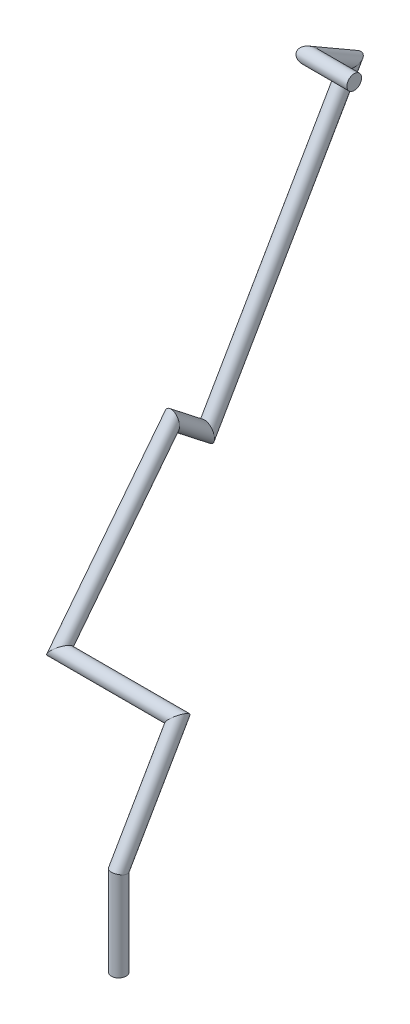
ISO-10303-21;
HEADER;
FILE_DESCRIPTION(('STEP AP214'),'2;1');
FILE_NAME('part.step','',(''),(''),'','','');
FILE_SCHEMA(('AUTOMOTIVE_DESIGN { 1 0 10303 214 1 1 1 1 }'));
ENDSEC;
DATA;
#1=APPLICATION_CONTEXT('core data for automotive mechanical design processes');
#2=APPLICATION_PROTOCOL_DEFINITION('international standard','automotive_design',2000,#1);
#3=PRODUCT_CONTEXT('',#1,'mechanical');
#4=PRODUCT('Part','Part','',(#3));
#5=PRODUCT_RELATED_PRODUCT_CATEGORY('part','',(#4));
#6=PRODUCT_DEFINITION_FORMATION('','',#4);
#7=PRODUCT_DEFINITION_CONTEXT('part definition',#1,'design');
#8=PRODUCT_DEFINITION('design','',#6,#7);
#9=PRODUCT_DEFINITION_SHAPE('','',#8);
#10=(LENGTH_UNIT() NAMED_UNIT(*) SI_UNIT(.MILLI.,.METRE.));
#11=(NAMED_UNIT(*) PLANE_ANGLE_UNIT() SI_UNIT($,.RADIAN.));
#12=(NAMED_UNIT(*) SI_UNIT($,.STERADIAN.) SOLID_ANGLE_UNIT());
#13=UNCERTAINTY_MEASURE_WITH_UNIT(LENGTH_MEASURE(1.E-05),#10,'distance_accuracy_value','');
#14=(GEOMETRIC_REPRESENTATION_CONTEXT(3) GLOBAL_UNCERTAINTY_ASSIGNED_CONTEXT((#13)) GLOBAL_UNIT_ASSIGNED_CONTEXT((#10,
#11,#12)) REPRESENTATION_CONTEXT('',''));
#15=CARTESIAN_POINT('',(0.,0.,0.));
#16=DIRECTION('',(0.,0.,1.));
#17=DIRECTION('',(1.,0.,0.));
#18=AXIS2_PLACEMENT_3D('',#15,#16,#17);
#19=CARTESIAN_POINT('',(-25.,197.133250315984,-105.134766313741));
#20=DIRECTION('',(-1.,0.,0.));
#21=DIRECTION('',(0.,0.,1.));
#22=AXIS2_PLACEMENT_3D('',#19,#20,#21);
#23=PLANE('',#22);
#24=CARTESIAN_POINT('',(-25.,197.133250315984,-105.134766313741));
#25=DIRECTION('',(-1.,0.,0.));
#26=DIRECTION('',(0.,0.,1.));
#27=AXIS2_PLACEMENT_3D('',#24,#25,#26);
#28=CIRCLE('',#27,2.5);
#29=CARTESIAN_POINT('',(-25.,197.133250315984,-102.634766313741));
#30=VERTEX_POINT('',#29);
#31=EDGE_CURVE('E46',#30,#30,#28,.T.);
#32=ORIENTED_EDGE('',*,*,#31,.F.);
#33=EDGE_LOOP('',(#32));
#34=FACE_BOUND('',#33,.T.);
#35=ADVANCED_FACE('F43',(#34),#23,.F.);
#36=CARTESIAN_POINT('',(0.,0.,0.));
#37=DIRECTION('',(0.,-1.,0.));
#38=DIRECTION('',(-0.788010753606725,0.,0.615661475325654));
#39=AXIS2_PLACEMENT_3D('',#36,#37,#38);
#40=PLANE('',#39);
#41=CARTESIAN_POINT('',(0.,0.,0.));
#42=DIRECTION('',(0.,-1.,0.));
#43=DIRECTION('',(-0.788010753606725,0.,0.615661475325654));
#44=AXIS2_PLACEMENT_3D('',#41,#42,#43);
#45=CIRCLE('',#44,2.5);
#46=CARTESIAN_POINT('',(-1.97002688401682,0.,1.53915368831419));
#47=VERTEX_POINT('',#46);
#48=EDGE_CURVE('E50',#47,#47,#45,.T.);
#49=ORIENTED_EDGE('',*,*,#48,.T.);
#50=EDGE_LOOP('',(#49));
#51=FACE_BOUND('',#50,.T.);
#52=ADVANCED_FACE('F81',(#51),#40,.T.);
#53=CARTESIAN_POINT('',(-45.2315698604072,197.133250315984,-105.134766313741));
#54=DIRECTION('',(1.,0.,0.));
#55=DIRECTION('',(0.,0.,-1.));
#56=AXIS2_PLACEMENT_3D('',#53,#54,#55);
#57=CYLINDRICAL_SURFACE('',#56,2.5);
#58=CARTESIAN_POINT('',(-40.,197.133250315984,-105.134766313741));
#59=DIRECTION('',(0.707106781186546,0.353553390593272,0.612372435695797));
#60=DIRECTION('',(-0.707106781186549,0.353553390593271,0.612372435695795));
#61=AXIS2_PLACEMENT_3D('',#58,#59,#60);
#62=ELLIPSE('',#61,3.53553390593275,2.5);
#63=CARTESIAN_POINT('',(-42.5,198.383250315984,-102.96970280428));
#64=VERTEX_POINT('',#63);
#65=EDGE_CURVE('E71',#64,#64,#62,.T.);
#66=ORIENTED_EDGE('',*,*,#65,.T.);
#67=EDGE_LOOP('',(#66));
#68=FACE_BOUND('',#67,.T.);
#69=ORIENTED_EDGE('',*,*,#31,.T.);
#70=EDGE_LOOP('',(#69));
#71=FACE_BOUND('',#70,.T.);
#72=ADVANCED_FACE('F78',(#68,#71),#57,.T.);
#73=CARTESIAN_POINT('',(-40.,186.014180455577,-124.393560244874));
#74=DIRECTION('',(0.,0.499999999999997,0.86602540378444));
#75=DIRECTION('',(0.,-0.86602540378444,0.499999999999997));
#76=AXIS2_PLACEMENT_3D('',#73,#74,#75);
#77=CYLINDRICAL_SURFACE('',#76,2.5);
#78=CARTESIAN_POINT('',(-40.,189.133250315984,-118.991172774292));
#79=DIRECTION('',(0.,0.965925826289068,0.258819045102522));
#80=DIRECTION('',(0.,0.258819045102522,-0.965925826289068));
#81=AXIS2_PLACEMENT_3D('',#78,#79,#80);
#82=ELLIPSE('',#81,3.53553390593275,2.5);
#83=CARTESIAN_POINT('',(-40.,190.048313825445,-122.406236283753));
#84=VERTEX_POINT('',#83);
#85=EDGE_CURVE('E69',#84,#84,#82,.T.);
#86=ORIENTED_EDGE('',*,*,#85,.T.);
#87=EDGE_LOOP('',(#86));
#88=FACE_BOUND('',#87,.T.);
#89=ORIENTED_EDGE('',*,*,#65,.F.);
#90=EDGE_LOOP('',(#89));
#91=FACE_BOUND('',#90,.T.);
#92=ADVANCED_FACE('F113',(#88,#91),#77,.T.);
#93=CARTESIAN_POINT('',(-40.,98.0610471614433,-66.4106117673251));
#94=DIRECTION('',(0.,0.866025403784438,-0.500000000000002));
#95=DIRECTION('',(0.,0.500000000000002,0.866025403784438));
#96=AXIS2_PLACEMENT_3D('',#93,#94,#95);
#97=CYLINDRICAL_SURFACE('',#96,2.5);
#98=CARTESIAN_POINT('',(-40.,104.262760745109,-69.9911727742918));
#99=DIRECTION('',(0.,0.190808995376544,-0.981627183447664));
#100=DIRECTION('',(0.,-0.981627183447664,-0.190808995376544));
#101=AXIS2_PLACEMENT_3D('',#98,#99,#100);
#102=ELLIPSE('',#101,3.81063271676453,2.5);
#103=CARTESIAN_POINT('',(-40.,100.522140084198,-70.7182757747266));
#104=VERTEX_POINT('',#103);
#105=EDGE_CURVE('E66',#104,#104,#102,.T.);
#106=ORIENTED_EDGE('',*,*,#105,.T.);
#107=EDGE_LOOP('',(#106));
#108=FACE_BOUND('',#107,.T.);
#109=ORIENTED_EDGE('',*,*,#85,.F.);
#110=EDGE_LOOP('',(#109));
#111=FACE_BOUND('',#110,.T.);
#112=ADVANCED_FACE('F109',(#108,#111),#97,.T.);
#113=CARTESIAN_POINT('',(-40.,117.338265178799,-53.2552902876879));
#114=DIRECTION('',(0.,-0.615661475325658,-0.788010753606722));
#115=DIRECTION('',(0.,0.788010753606722,-0.615661475325658));
#116=AXIS2_PLACEMENT_3D('',#113,#114,#115);
#117=CYLINDRICAL_SURFACE('',#116,2.5);
#118=CARTESIAN_POINT('',(-40.,113.497682874994,-58.1710114701909));
#119=DIRECTION('',(0.,0.121869343405147,-0.992546151641322));
#120=DIRECTION('',(0.,0.992546151641322,0.121869343405147));
#121=AXIS2_PLACEMENT_3D('',#118,#119,#120);
#122=ELLIPSE('',#121,3.53553390593274,2.5);
#123=CARTESIAN_POINT('',(-40.,117.006863447325,-57.7401382744883));
#124=VERTEX_POINT('',#123);
#125=EDGE_CURVE('E63',#124,#124,#122,.T.);
#126=ORIENTED_EDGE('',*,*,#125,.T.);
#127=EDGE_LOOP('',(#126));
#128=FACE_BOUND('',#127,.T.);
#129=ORIENTED_EDGE('',*,*,#105,.F.);
#130=EDGE_LOOP('',(#129));
#131=FACE_BOUND('',#130,.T.);
#132=ADVANCED_FACE('F105',(#128,#131),#117,.T.);
#133=CARTESIAN_POINT('',(-40.,60.518482843132,-16.7791239814724));
#134=DIRECTION('',(0.,0.788010753606721,-0.61566147532566));
#135=DIRECTION('',(0.,0.61566147532566,0.788010753606721));
#136=AXIS2_PLACEMENT_3D('',#133,#134,#135);
#137=CYLINDRICAL_SURFACE('',#136,2.5);
#138=CARTESIAN_POINT('',(-40.,64.6410161513776,-20.));
#139=DIRECTION('',(-0.707106781186547,0.557207747523234,-0.435338404118088));
#140=DIRECTION('',(-0.707106781186548,-0.557207747523234,0.435338404118089));
#141=AXIS2_PLACEMENT_3D('',#138,#139,#140);
#142=ELLIPSE('',#141,3.53553390593274,2.5);
#143=CARTESIAN_POINT('',(-42.5,62.6709892673608,-18.4608463116858));
#144=VERTEX_POINT('',#143);
#145=EDGE_CURVE('E60',#144,#144,#142,.T.);
#146=ORIENTED_EDGE('',*,*,#145,.T.);
#147=EDGE_LOOP('',(#146));
#148=FACE_BOUND('',#147,.T.);
#149=ORIENTED_EDGE('',*,*,#125,.F.);
#150=EDGE_LOOP('',(#149));
#151=FACE_BOUND('',#150,.T.);
#152=ADVANCED_FACE('F101',(#148,#151),#137,.T.);
#153=CARTESIAN_POINT('',(5.65316768670965,64.6410161513776,-20.));
#154=DIRECTION('',(-1.,0.,0.));
#155=DIRECTION('',(0.,-1.,0.));
#156=AXIS2_PLACEMENT_3D('',#153,#154,#155);
#157=CYLINDRICAL_SURFACE('',#156,2.5);
#158=CARTESIAN_POINT('',(0.,64.6410161513776,-20.));
#159=DIRECTION('',(-0.707106781186547,0.612372435695795,-0.353553390593274));
#160=DIRECTION('',(0.707106781186548,0.612372435695794,-0.353553390593275));
#161=AXIS2_PLACEMENT_3D('',#158,#159,#160);
#162=ELLIPSE('',#161,3.53553390593274,2.5);
#163=CARTESIAN_POINT('',(2.50000000000001,66.8060796608387,-21.25));
#164=VERTEX_POINT('',#163);
#165=EDGE_CURVE('E55',#164,#164,#162,.T.);
#166=ORIENTED_EDGE('',*,*,#165,.T.);
#167=EDGE_LOOP('',(#166));
#168=FACE_BOUND('',#167,.T.);
#169=ORIENTED_EDGE('',*,*,#145,.F.);
#170=EDGE_LOOP('',(#169));
#171=FACE_BOUND('',#170,.T.);
#172=ADVANCED_FACE('F94',(#168,#171),#157,.T.);
#173=CARTESIAN_POINT('',(0.,28.5147974930304,0.857482067200127));
#174=DIRECTION('',(0.,0.866025403784438,-0.500000000000001));
#175=DIRECTION('',(0.,0.500000000000001,0.866025403784438));
#176=AXIS2_PLACEMENT_3D('',#173,#174,#175);
#177=CYLINDRICAL_SURFACE('',#176,2.5);
#178=CARTESIAN_POINT('',(0.,30.,0.));
#179=DIRECTION('',(0.,0.965925826289068,-0.258819045102521));
#180=DIRECTION('',(0.,0.258819045102521,0.965925826289068));
#181=AXIS2_PLACEMENT_3D('',#178,#179,#180);
#182=ELLIPSE('',#181,2.58819045102521,2.5);
#183=CARTESIAN_POINT('',(0.,30.6698729810778,2.50000000000006));
#184=VERTEX_POINT('',#183);
#185=EDGE_CURVE('E11',#184,#184,#182,.T.);
#186=ORIENTED_EDGE('',*,*,#185,.T.);
#187=EDGE_LOOP('',(#186));
#188=FACE_BOUND('',#187,.T.);
#189=ORIENTED_EDGE('',*,*,#165,.F.);
#190=EDGE_LOOP('',(#189));
#191=FACE_BOUND('',#190,.T.);
#192=ADVANCED_FACE('F88',(#188,#191),#177,.T.);
#193=CARTESIAN_POINT('',(0.,0.,0.));
#194=DIRECTION('',(0.,1.,0.));
#195=DIRECTION('',(0.,0.,1.));
#196=AXIS2_PLACEMENT_3D('',#193,#194,#195);
#197=CYLINDRICAL_SURFACE('',#196,2.5);
#198=ORIENTED_EDGE('',*,*,#48,.F.);
#199=EDGE_LOOP('',(#198));
#200=FACE_BOUND('',#199,.T.);
#201=ORIENTED_EDGE('',*,*,#185,.F.);
#202=EDGE_LOOP('',(#201));
#203=FACE_BOUND('',#202,.T.);
#204=ADVANCED_FACE('F86',(#200,#203),#197,.T.);
#205=CLOSED_SHELL('',(#35,#52,#72,#92,#112,#132,#152,#172,#192,#204));
#206=MANIFOLD_SOLID_BREP('B2',#205);
#207=ADVANCED_BREP_SHAPE_REPRESENTATION('',(#18,#206),#14);
#208=SHAPE_DEFINITION_REPRESENTATION(#9,#207);
ENDSEC;
END-ISO-10303-21;
